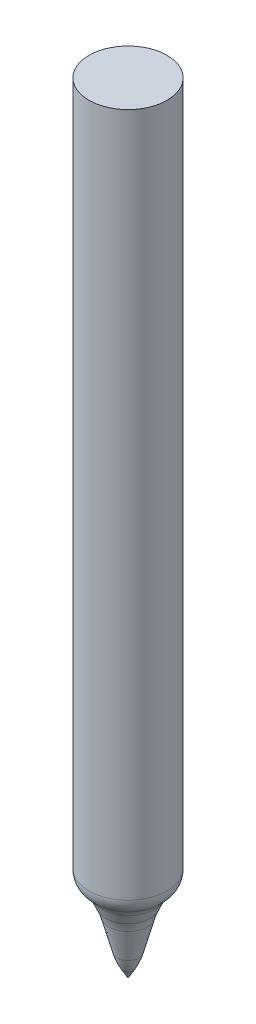
ISO-10303-21;
HEADER;
FILE_DESCRIPTION(('STEP AP214'),'2;1');
FILE_NAME('part.step','',(''),(''),'','','');
FILE_SCHEMA(('AUTOMOTIVE_DESIGN { 1 0 10303 214 1 1 1 1 }'));
ENDSEC;
DATA;
#1=APPLICATION_CONTEXT('core data for automotive mechanical design processes');
#2=APPLICATION_PROTOCOL_DEFINITION('international standard','automotive_design',2000,#1);
#3=PRODUCT_CONTEXT('',#1,'mechanical');
#4=PRODUCT('Part','Part','',(#3));
#5=PRODUCT_RELATED_PRODUCT_CATEGORY('part','',(#4));
#6=PRODUCT_DEFINITION_FORMATION('','',#4);
#7=PRODUCT_DEFINITION_CONTEXT('part definition',#1,'design');
#8=PRODUCT_DEFINITION('design','',#6,#7);
#9=PRODUCT_DEFINITION_SHAPE('','',#8);
#10=(LENGTH_UNIT() NAMED_UNIT(*) SI_UNIT(.MILLI.,.METRE.));
#11=(NAMED_UNIT(*) PLANE_ANGLE_UNIT() SI_UNIT($,.RADIAN.));
#12=(NAMED_UNIT(*) SI_UNIT($,.STERADIAN.) SOLID_ANGLE_UNIT());
#13=UNCERTAINTY_MEASURE_WITH_UNIT(LENGTH_MEASURE(1.E-05),#10,'distance_accuracy_value','');
#14=(GEOMETRIC_REPRESENTATION_CONTEXT(3) GLOBAL_UNCERTAINTY_ASSIGNED_CONTEXT((#13)) GLOBAL_UNIT_ASSIGNED_CONTEXT((#10,
#11,#12)) REPRESENTATION_CONTEXT('',''));
#15=CARTESIAN_POINT('',(0.,0.,0.));
#16=DIRECTION('',(0.,0.,1.));
#17=DIRECTION('',(1.,0.,0.));
#18=AXIS2_PLACEMENT_3D('',#15,#16,#17);
#19=CARTESIAN_POINT('',(0.,7.62,0.));
#20=DIRECTION('',(0.,1.,0.));
#21=DIRECTION('',(0.,0.,1.));
#22=AXIS2_PLACEMENT_3D('',#19,#20,#21);
#23=CONICAL_SURFACE('',#22,2.66057499984215,0.424955490966551);
#24=CARTESIAN_POINT('',(0.,8.18759530540032,0.));
#25=DIRECTION('',(0.,1.,0.));
#26=DIRECTION('',(0.,0.,1.));
#27=AXIS2_PLACEMENT_3D('',#24,#25,#26);
#28=CIRCLE('',#27,2.91742863527497);
#29=CARTESIAN_POINT('',(0.,8.18759530540032,2.91742863527497));
#30=VERTEX_POINT('',#29);
#31=EDGE_CURVE('E11',#30,#30,#28,.T.);
#32=ORIENTED_EDGE('',*,*,#31,.T.);
#33=EDGE_LOOP('',(#32));
#34=FACE_BOUND('',#33,.T.);
#35=CARTESIAN_POINT('',(0.,9.55262706002498,0.));
#36=DIRECTION('',(0.,1.,0.));
#37=DIRECTION('',(0.,0.,1.));
#38=AXIS2_PLACEMENT_3D('',#35,#36,#37);
#39=CIRCLE('',#38,3.5351458103832);
#40=CARTESIAN_POINT('',(0.,9.55262706002498,3.5351458103832));
#41=VERTEX_POINT('',#40);
#42=EDGE_CURVE('E96',#41,#41,#39,.F.);
#43=ORIENTED_EDGE('',*,*,#42,.T.);
#44=EDGE_LOOP('',(#43));
#45=FACE_BOUND('',#44,.T.);
#46=ADVANCED_FACE('F35',(#34,#45),#23,.T.);
#47=CARTESIAN_POINT('',(0.,0.,0.));
#48=DIRECTION('',(0.,-1.,0.));
#49=DIRECTION('',(0.,0.,-1.));
#50=AXIS2_PLACEMENT_3D('',#47,#48,#49);
#51=CYLINDRICAL_SURFACE('',#50,5.08);
#52=CARTESIAN_POINT('',(0.,12.3597045256125,0.));
#53=DIRECTION('',(0.,-1.,0.));
#54=DIRECTION('',(0.,0.,-1.));
#55=AXIS2_PLACEMENT_3D('',#52,#53,#54);
#56=CIRCLE('',#55,5.08);
#57=CARTESIAN_POINT('',(0.,12.3597045256125,-5.08));
#58=VERTEX_POINT('',#57);
#59=EDGE_CURVE('E104',#58,#58,#56,.F.);
#60=ORIENTED_EDGE('',*,*,#59,.T.);
#61=EDGE_LOOP('',(#60));
#62=FACE_BOUND('',#61,.T.);
#63=CARTESIAN_POINT('',(0.,101.6,0.));
#64=DIRECTION('',(0.,-1.,0.));
#65=DIRECTION('',(0.,0.,-1.));
#66=AXIS2_PLACEMENT_3D('',#63,#64,#65);
#67=CIRCLE('',#66,5.08);
#68=CARTESIAN_POINT('',(0.,101.6,-5.08));
#69=VERTEX_POINT('',#68);
#70=EDGE_CURVE('E107',#69,#69,#67,.T.);
#71=ORIENTED_EDGE('',*,*,#70,.T.);
#72=EDGE_LOOP('',(#71));
#73=FACE_BOUND('',#72,.T.);
#74=ADVANCED_FACE('F58',(#62,#73),#51,.T.);
#75=CARTESIAN_POINT('',(0.,101.6,0.));
#76=DIRECTION('',(0.,-1.,0.));
#77=DIRECTION('',(0.,0.,-1.));
#78=AXIS2_PLACEMENT_3D('',#75,#76,#77);
#79=PLANE('',#78);
#80=ORIENTED_EDGE('',*,*,#70,.F.);
#81=EDGE_LOOP('',(#80));
#82=FACE_BOUND('',#81,.T.);
#83=ADVANCED_FACE('F48',(#82),#79,.F.);
#84=CARTESIAN_POINT('',(0.,2.,0.));
#85=DIRECTION('',(0.,1.,0.));
#86=DIRECTION('',(0.,0.,1.));
#87=AXIS2_PLACEMENT_3D('',#84,#85,#86);
#88=CONICAL_SURFACE('',#87,1.15470053837926,0.523598775598304);
#89=CARTESIAN_POINT('',(0.,1.13121021574643,0.));
#90=DIRECTION('',(0.,1.,0.));
#91=DIRECTION('',(0.,0.,1.));
#92=AXIS2_PLACEMENT_3D('',#89,#90,#91);
#93=CIRCLE('',#92,0.653104522571265);
#94=CARTESIAN_POINT('',(0.,1.13121021574643,0.653104522571265));
#95=VERTEX_POINT('',#94);
#96=EDGE_CURVE('E89',#95,#95,#93,.F.);
#97=ORIENTED_EDGE('',*,*,#96,.T.);
#98=EDGE_LOOP('',(#97));
#99=FACE_BOUND('',#98,.T.);
#100=CARTESIAN_POINT('',(0.,0.,0.));
#101=VERTEX_POINT('',#100);
#102=VERTEX_LOOP('',#101);
#103=FACE_BOUND('',#102,.T.);
#104=ADVANCED_FACE('F45',(#99,#103),#88,.T.);
#105=CARTESIAN_POINT('',(0.,2.,0.));
#106=DIRECTION('',(0.,1.,0.));
#107=DIRECTION('',(0.,0.,1.));
#108=AXIS2_PLACEMENT_3D('',#105,#106,#107);
#109=CONICAL_SURFACE('',#108,1.15470053837926,0.261799387799146);
#110=CARTESIAN_POINT('',(0.,2.96900909206528,0.));
#111=DIRECTION('',(0.,1.,0.));
#112=DIRECTION('',(0.,0.,1.));
#113=AXIS2_PLACEMENT_3D('',#110,#111,#112);
#114=CIRCLE('',#113,1.41434574205657);
#115=CARTESIAN_POINT('',(0.,2.96900909206528,1.41434574205657));
#116=VERTEX_POINT('',#115);
#117=EDGE_CURVE('E42',#116,#116,#114,.T.);
#118=ORIENTED_EDGE('',*,*,#117,.T.);
#119=EDGE_LOOP('',(#118));
#120=FACE_BOUND('',#119,.T.);
#121=CARTESIAN_POINT('',(0.,7.01822106214383,0.));
#122=DIRECTION('',(0.,1.,0.));
#123=DIRECTION('',(0.,0.,1.));
#124=AXIS2_PLACEMENT_3D('',#121,#122,#123);
#125=CIRCLE('',#124,2.49932881942154);
#126=CARTESIAN_POINT('',(0.,7.01822106214383,2.49932881942154));
#127=VERTEX_POINT('',#126);
#128=EDGE_CURVE('E90',#127,#127,#125,.F.);
#129=ORIENTED_EDGE('',*,*,#128,.T.);
#130=EDGE_LOOP('',(#129));
#131=FACE_BOUND('',#130,.T.);
#132=ADVANCED_FACE('F47',(#120,#131),#109,.T.);
#133=CARTESIAN_POINT('',(0.,12.3597045256125,0.));
#134=DIRECTION('',(0.,-1.,0.));
#135=DIRECTION('',(0.,0.,-1.));
#136=AXIS2_PLACEMENT_3D('',#133,#134,#135);
#137=DEGENERATE_TOROIDAL_SURFACE('',#136,2.54,2.54,.T.);
#138=CARTESIAN_POINT('',(0.,10.4325698983291,0.));
#139=DIRECTION('',(0.,1.,0.));
#140=DIRECTION('',(0.,0.,1.));
#141=AXIS2_PLACEMENT_3D('',#138,#139,#140);
#142=CIRCLE('',#141,4.19461540193648);
#143=CARTESIAN_POINT('',(0.,10.4325698983291,4.19461540193648));
#144=VERTEX_POINT('',#143);
#145=EDGE_CURVE('E91',#144,#144,#142,.T.);
#146=ORIENTED_EDGE('',*,*,#145,.T.);
#147=EDGE_LOOP('',(#146));
#148=FACE_BOUND('',#147,.T.);
#149=ORIENTED_EDGE('',*,*,#59,.F.);
#150=EDGE_LOOP('',(#149));
#151=FACE_BOUND('',#150,.T.);
#152=ADVANCED_FACE('F55',(#148,#151),#137,.T.);
#153=CARTESIAN_POINT('',(0.,8.50543527104575,0.));
#154=DIRECTION('',(0.,-1.,0.));
#155=DIRECTION('',(0.,0.,-1.));
#156=AXIS2_PLACEMENT_3D('',#153,#154,#155);
#157=TOROIDAL_SURFACE('',#156,5.84923080387296,2.54);
#158=ORIENTED_EDGE('',*,*,#145,.F.);
#159=EDGE_LOOP('',(#158));
#160=FACE_BOUND('',#159,.T.);
#161=ORIENTED_EDGE('',*,*,#42,.F.);
#162=EDGE_LOOP('',(#161));
#163=FACE_BOUND('',#162,.T.);
#164=ADVANCED_FACE('F74',(#160,#163),#157,.F.);
#165=CARTESIAN_POINT('',(0.,4.94121021574647,0.));
#166=DIRECTION('',(0.,1.,0.));
#167=DIRECTION('',(0.,0.,1.));
#168=AXIS2_PLACEMENT_3D('',#165,#166,#167);
#169=DEGENERATE_TOROIDAL_SURFACE('',#168,5.94600905426614,7.62,.F.);
#170=ORIENTED_EDGE('',*,*,#117,.F.);
#171=EDGE_LOOP('',(#170));
#172=FACE_BOUND('',#171,.T.);
#173=ORIENTED_EDGE('',*,*,#96,.F.);
#174=EDGE_LOOP('',(#173));
#175=FACE_BOUND('',#174,.T.);
#176=ADVANCED_FACE('F77',(#172,#175),#169,.F.);
#177=CARTESIAN_POINT('',(0.,5.04601993846264,0.));
#178=DIRECTION('',(0.,-1.,0.));
#179=DIRECTION('',(0.,0.,-1.));
#180=AXIS2_PLACEMENT_3D('',#177,#178,#179);
#181=TOROIDAL_SURFACE('',#180,9.85968361574424,7.62);
#182=ORIENTED_EDGE('',*,*,#31,.F.);
#183=EDGE_LOOP('',(#182));
#184=FACE_BOUND('',#183,.T.);
#185=ORIENTED_EDGE('',*,*,#128,.F.);
#186=EDGE_LOOP('',(#185));
#187=FACE_BOUND('',#186,.T.);
#188=ADVANCED_FACE('F37',(#184,#187),#181,.F.);
#189=CLOSED_SHELL('',(#46,#74,#83,#104,#132,#152,#164,#176,#188));
#190=MANIFOLD_SOLID_BREP('B2',#189);
#191=ADVANCED_BREP_SHAPE_REPRESENTATION('',(#18,#190),#14);
#192=SHAPE_DEFINITION_REPRESENTATION(#9,#191);
ENDSEC;
END-ISO-10303-21;
